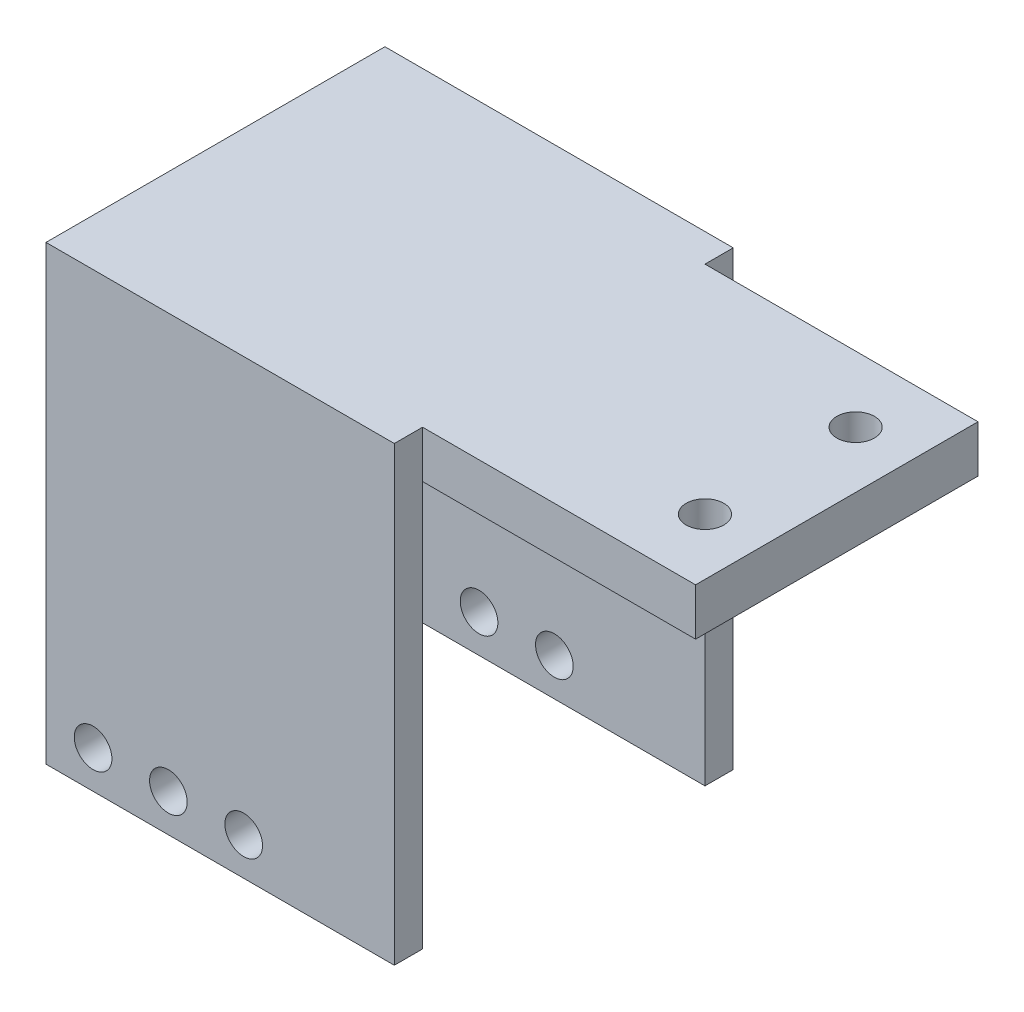
ISO-10303-21;
HEADER;
FILE_DESCRIPTION(('STEP AP214'),'2;1');
FILE_NAME('part.step','',(''),(''),'','','');
FILE_SCHEMA(('AUTOMOTIVE_DESIGN { 1 0 10303 214 1 1 1 1 }'));
ENDSEC;
DATA;
#1=APPLICATION_CONTEXT('core data for automotive mechanical design processes');
#2=APPLICATION_PROTOCOL_DEFINITION('international standard','automotive_design',2000,#1);
#3=PRODUCT_CONTEXT('',#1,'mechanical');
#4=PRODUCT('Part','Part','',(#3));
#5=PRODUCT_RELATED_PRODUCT_CATEGORY('part','',(#4));
#6=PRODUCT_DEFINITION_FORMATION('','',#4);
#7=PRODUCT_DEFINITION_CONTEXT('part definition',#1,'design');
#8=PRODUCT_DEFINITION('design','',#6,#7);
#9=PRODUCT_DEFINITION_SHAPE('','',#8);
#10=(LENGTH_UNIT() NAMED_UNIT(*) SI_UNIT(.MILLI.,.METRE.));
#11=(NAMED_UNIT(*) PLANE_ANGLE_UNIT() SI_UNIT($,.RADIAN.));
#12=(NAMED_UNIT(*) SI_UNIT($,.STERADIAN.) SOLID_ANGLE_UNIT());
#13=UNCERTAINTY_MEASURE_WITH_UNIT(LENGTH_MEASURE(1.E-05),#10,'distance_accuracy_value','');
#14=(GEOMETRIC_REPRESENTATION_CONTEXT(3) GLOBAL_UNCERTAINTY_ASSIGNED_CONTEXT((#13)) GLOBAL_UNIT_ASSIGNED_CONTEXT((#10,
#11,#12)) REPRESENTATION_CONTEXT('',''));
#15=CARTESIAN_POINT('',(0.,0.,0.));
#16=DIRECTION('',(0.,0.,1.));
#17=DIRECTION('',(1.,0.,0.));
#18=AXIS2_PLACEMENT_3D('',#15,#16,#17);
#19=CARTESIAN_POINT('',(0.,5.,0.));
#20=DIRECTION('',(0.,0.,-1.));
#21=DIRECTION('',(-1.,0.,0.));
#22=AXIS2_PLACEMENT_3D('',#19,#20,#21);
#23=PLANE('',#22);
#24=DIRECTION('',(0.,1.,0.));
#25=VECTOR('',#24,1.);
#26=CARTESIAN_POINT('',(37.,-43.,0.));
#27=LINE('',#26,#25);
#28=CARTESIAN_POINT('',(37.,0.,0.));
#29=VERTEX_POINT('',#28);
#30=CARTESIAN_POINT('',(37.,5.,0.));
#31=VERTEX_POINT('',#30);
#32=EDGE_CURVE('E12',#29,#31,#27,.T.);
#33=ORIENTED_EDGE('',*,*,#32,.F.);
#34=DIRECTION('',(1.,0.,0.));
#35=VECTOR('',#34,1.);
#36=CARTESIAN_POINT('',(0.,0.,0.));
#37=LINE('',#36,#35);
#38=CARTESIAN_POINT('',(66.,0.,0.));
#39=VERTEX_POINT('',#38);
#40=EDGE_CURVE('E209',#29,#39,#37,.T.);
#41=ORIENTED_EDGE('',*,*,#40,.T.);
#42=DIRECTION('',(0.,-1.,0.));
#43=VECTOR('',#42,1.);
#44=CARTESIAN_POINT('',(66.,5.,0.));
#45=LINE('',#44,#43);
#46=CARTESIAN_POINT('',(66.,5.,0.));
#47=VERTEX_POINT('',#46);
#48=EDGE_CURVE('E38',#47,#39,#45,.T.);
#49=ORIENTED_EDGE('',*,*,#48,.F.);
#50=DIRECTION('',(1.,0.,0.));
#51=VECTOR('',#50,1.);
#52=CARTESIAN_POINT('',(0.,5.,0.));
#53=LINE('',#52,#51);
#54=EDGE_CURVE('E199',#31,#47,#53,.T.);
#55=ORIENTED_EDGE('',*,*,#54,.F.);
#56=EDGE_LOOP('',(#33,#41,#49,#55));
#57=FACE_BOUND('',#56,.T.);
#58=ADVANCED_FACE('F34',(#57),#23,.F.);
#59=CARTESIAN_POINT('',(0.,5.,0.));
#60=DIRECTION('',(0.,-1.,0.));
#61=DIRECTION('',(0.,0.,-1.));
#62=AXIS2_PLACEMENT_3D('',#59,#60,#61);
#63=PLANE('',#62);
#64=DIRECTION('',(0.,0.,1.));
#65=VECTOR('',#64,1.);
#66=CARTESIAN_POINT('',(0.,5.,0.));
#67=LINE('',#66,#65);
#68=CARTESIAN_POINT('',(0.,5.,-33.));
#69=VERTEX_POINT('',#68);
#70=CARTESIAN_POINT('',(0.,5.,3.));
#71=VERTEX_POINT('',#70);
#72=EDGE_CURVE('E197',#69,#71,#67,.T.);
#73=ORIENTED_EDGE('',*,*,#72,.T.);
#74=DIRECTION('',(1.,0.,0.));
#75=VECTOR('',#74,1.);
#76=CARTESIAN_POINT('',(0.,5.,3.));
#77=LINE('',#76,#75);
#78=CARTESIAN_POINT('',(37.,5.,3.));
#79=VERTEX_POINT('',#78);
#80=EDGE_CURVE('E124',#71,#79,#77,.T.);
#81=ORIENTED_EDGE('',*,*,#80,.T.);
#82=DIRECTION('',(0.,0.,-1.));
#83=VECTOR('',#82,1.);
#84=CARTESIAN_POINT('',(37.,5.,0.));
#85=LINE('',#84,#83);
#86=EDGE_CURVE('E143',#79,#31,#85,.T.);
#87=ORIENTED_EDGE('',*,*,#86,.T.);
#88=ORIENTED_EDGE('',*,*,#54,.T.);
#89=DIRECTION('',(0.,0.,-1.));
#90=VECTOR('',#89,1.);
#91=CARTESIAN_POINT('',(66.,5.,0.));
#92=LINE('',#91,#90);
#93=CARTESIAN_POINT('',(66.,5.,-30.));
#94=VERTEX_POINT('',#93);
#95=EDGE_CURVE('E202',#47,#94,#92,.T.);
#96=ORIENTED_EDGE('',*,*,#95,.T.);
#97=DIRECTION('',(-1.,0.,0.));
#98=VECTOR('',#97,1.);
#99=CARTESIAN_POINT('',(0.,5.,-30.));
#100=LINE('',#99,#98);
#101=CARTESIAN_POINT('',(37.,5.,-30.));
#102=VERTEX_POINT('',#101);
#103=EDGE_CURVE('E204',#94,#102,#100,.T.);
#104=ORIENTED_EDGE('',*,*,#103,.T.);
#105=DIRECTION('',(0.,0.,-1.));
#106=VECTOR('',#105,1.);
#107=CARTESIAN_POINT('',(37.,5.,-30.));
#108=LINE('',#107,#106);
#109=CARTESIAN_POINT('',(37.,5.,-33.));
#110=VERTEX_POINT('',#109);
#111=EDGE_CURVE('E58',#102,#110,#108,.T.);
#112=ORIENTED_EDGE('',*,*,#111,.T.);
#113=DIRECTION('',(-1.,0.,0.));
#114=VECTOR('',#113,1.);
#115=CARTESIAN_POINT('',(0.,5.,-33.));
#116=LINE('',#115,#114);
#117=EDGE_CURVE('E161',#110,#69,#116,.T.);
#118=ORIENTED_EDGE('',*,*,#117,.T.);
#119=EDGE_LOOP('',(#73,#81,#87,#88,#96,#104,#112,#118));
#120=FACE_BOUND('',#119,.T.);
#121=CARTESIAN_POINT('',(60.,5.,-23.));
#122=DIRECTION('',(0.,1.,0.));
#123=DIRECTION('',(0.,0.,1.));
#124=AXIS2_PLACEMENT_3D('',#121,#122,#123);
#125=CIRCLE('',#124,2.);
#126=CARTESIAN_POINT('',(60.,5.,-21.));
#127=VERTEX_POINT('',#126);
#128=EDGE_CURVE('E191',#127,#127,#125,.T.);
#129=ORIENTED_EDGE('',*,*,#128,.F.);
#130=EDGE_LOOP('',(#129));
#131=FACE_BOUND('',#130,.T.);
#132=CARTESIAN_POINT('',(60.,5.,-7.));
#133=DIRECTION('',(0.,1.,0.));
#134=DIRECTION('',(0.,0.,1.));
#135=AXIS2_PLACEMENT_3D('',#132,#133,#134);
#136=CIRCLE('',#135,2.);
#137=CARTESIAN_POINT('',(60.,5.,-5.));
#138=VERTEX_POINT('',#137);
#139=EDGE_CURVE('E185',#138,#138,#136,.T.);
#140=ORIENTED_EDGE('',*,*,#139,.F.);
#141=EDGE_LOOP('',(#140));
#142=FACE_BOUND('',#141,.T.);
#143=ADVANCED_FACE('F229',(#120,#131,#142),#63,.F.);
#144=CARTESIAN_POINT('',(0.,0.,0.));
#145=DIRECTION('',(0.,-1.,0.));
#146=DIRECTION('',(0.,0.,-1.));
#147=AXIS2_PLACEMENT_3D('',#144,#145,#146);
#148=PLANE('',#147);
#149=CARTESIAN_POINT('',(60.,0.,-23.));
#150=DIRECTION('',(0.,1.,0.));
#151=DIRECTION('',(0.,0.,1.));
#152=AXIS2_PLACEMENT_3D('',#149,#150,#151);
#153=CIRCLE('',#152,2.);
#154=CARTESIAN_POINT('',(60.,0.,-21.));
#155=VERTEX_POINT('',#154);
#156=EDGE_CURVE('E188',#155,#155,#153,.T.);
#157=ORIENTED_EDGE('',*,*,#156,.T.);
#158=EDGE_LOOP('',(#157));
#159=FACE_BOUND('',#158,.T.);
#160=DIRECTION('',(0.,0.,1.));
#161=VECTOR('',#160,1.);
#162=CARTESIAN_POINT('',(0.,0.,0.));
#163=LINE('',#162,#161);
#164=CARTESIAN_POINT('',(0.,0.,-30.));
#165=VERTEX_POINT('',#164);
#166=CARTESIAN_POINT('',(0.,0.,0.));
#167=VERTEX_POINT('',#166);
#168=EDGE_CURVE('E194',#165,#167,#163,.T.);
#169=ORIENTED_EDGE('',*,*,#168,.F.);
#170=DIRECTION('',(-1.,0.,0.));
#171=VECTOR('',#170,1.);
#172=CARTESIAN_POINT('',(0.,0.,-30.));
#173=LINE('',#172,#171);
#174=CARTESIAN_POINT('',(37.,0.,-30.));
#175=VERTEX_POINT('',#174);
#176=EDGE_CURVE('E215',#175,#165,#173,.T.);
#177=ORIENTED_EDGE('',*,*,#176,.F.);
#178=CARTESIAN_POINT('',(66.,0.,-30.));
#179=VERTEX_POINT('',#178);
#180=EDGE_CURVE('E200',#179,#175,#173,.T.);
#181=ORIENTED_EDGE('',*,*,#180,.F.);
#182=DIRECTION('',(0.,0.,-1.));
#183=VECTOR('',#182,1.);
#184=CARTESIAN_POINT('',(66.,0.,0.));
#185=LINE('',#184,#183);
#186=EDGE_CURVE('E213',#39,#179,#185,.T.);
#187=ORIENTED_EDGE('',*,*,#186,.F.);
#188=ORIENTED_EDGE('',*,*,#40,.F.);
#189=EDGE_CURVE('E210',#167,#29,#37,.T.);
#190=ORIENTED_EDGE('',*,*,#189,.F.);
#191=EDGE_LOOP('',(#169,#177,#181,#187,#188,#190));
#192=FACE_BOUND('',#191,.T.);
#193=CARTESIAN_POINT('',(60.,0.,-7.));
#194=DIRECTION('',(0.,1.,0.));
#195=DIRECTION('',(0.,0.,1.));
#196=AXIS2_PLACEMENT_3D('',#193,#194,#195);
#197=CIRCLE('',#196,2.);
#198=CARTESIAN_POINT('',(60.,0.,-5.));
#199=VERTEX_POINT('',#198);
#200=EDGE_CURVE('E177',#199,#199,#197,.T.);
#201=ORIENTED_EDGE('',*,*,#200,.T.);
#202=EDGE_LOOP('',(#201));
#203=FACE_BOUND('',#202,.T.);
#204=ADVANCED_FACE('F235',(#159,#192,#203),#148,.T.);
#205=CARTESIAN_POINT('',(0.,5.,0.));
#206=DIRECTION('',(1.,0.,0.));
#207=DIRECTION('',(0.,0.,-1.));
#208=AXIS2_PLACEMENT_3D('',#205,#206,#207);
#209=PLANE('',#208);
#210=ORIENTED_EDGE('',*,*,#168,.T.);
#211=DIRECTION('',(0.,1.,0.));
#212=VECTOR('',#211,1.);
#213=CARTESIAN_POINT('',(0.,-43.,0.));
#214=LINE('',#213,#212);
#215=CARTESIAN_POINT('',(0.,-43.,0.));
#216=VERTEX_POINT('',#215);
#217=EDGE_CURVE('E142',#216,#167,#214,.T.);
#218=ORIENTED_EDGE('',*,*,#217,.F.);
#219=DIRECTION('',(0.,0.,1.));
#220=VECTOR('',#219,1.);
#221=CARTESIAN_POINT('',(0.,-43.,0.));
#222=LINE('',#221,#220);
#223=CARTESIAN_POINT('',(0.,-43.,3.));
#224=VERTEX_POINT('',#223);
#225=EDGE_CURVE('E135',#216,#224,#222,.T.);
#226=ORIENTED_EDGE('',*,*,#225,.T.);
#227=DIRECTION('',(0.,1.,0.));
#228=VECTOR('',#227,1.);
#229=CARTESIAN_POINT('',(0.,-43.,3.));
#230=LINE('',#229,#228);
#231=EDGE_CURVE('E119',#224,#71,#230,.T.);
#232=ORIENTED_EDGE('',*,*,#231,.T.);
#233=ORIENTED_EDGE('',*,*,#72,.F.);
#234=DIRECTION('',(0.,1.,0.));
#235=VECTOR('',#234,1.);
#236=CARTESIAN_POINT('',(0.,-43.,-33.));
#237=LINE('',#236,#235);
#238=CARTESIAN_POINT('',(0.,-43.,-33.));
#239=VERTEX_POINT('',#238);
#240=EDGE_CURVE('E174',#239,#69,#237,.T.);
#241=ORIENTED_EDGE('',*,*,#240,.F.);
#242=DIRECTION('',(0.,0.,1.));
#243=VECTOR('',#242,1.);
#244=CARTESIAN_POINT('',(0.,-43.,-30.));
#245=LINE('',#244,#243);
#246=CARTESIAN_POINT('',(0.,-43.,-30.));
#247=VERTEX_POINT('',#246);
#248=EDGE_CURVE('E157',#239,#247,#245,.T.);
#249=ORIENTED_EDGE('',*,*,#248,.T.);
#250=DIRECTION('',(0.,1.,0.));
#251=VECTOR('',#250,1.);
#252=CARTESIAN_POINT('',(0.,-43.,-30.));
#253=LINE('',#252,#251);
#254=EDGE_CURVE('E170',#247,#165,#253,.T.);
#255=ORIENTED_EDGE('',*,*,#254,.T.);
#256=EDGE_LOOP('',(#210,#218,#226,#232,#233,#241,#249,#255));
#257=FACE_BOUND('',#256,.T.);
#258=ADVANCED_FACE('F36',(#257),#209,.F.);
#259=CARTESIAN_POINT('',(66.,5.,0.));
#260=DIRECTION('',(-1.,0.,0.));
#261=DIRECTION('',(0.,0.,1.));
#262=AXIS2_PLACEMENT_3D('',#259,#260,#261);
#263=PLANE('',#262);
#264=ORIENTED_EDGE('',*,*,#186,.T.);
#265=DIRECTION('',(0.,-1.,0.));
#266=VECTOR('',#265,1.);
#267=CARTESIAN_POINT('',(66.,5.,-30.));
#268=LINE('',#267,#266);
#269=EDGE_CURVE('E207',#94,#179,#268,.T.);
#270=ORIENTED_EDGE('',*,*,#269,.F.);
#271=ORIENTED_EDGE('',*,*,#95,.F.);
#272=ORIENTED_EDGE('',*,*,#48,.T.);
#273=EDGE_LOOP('',(#264,#270,#271,#272));
#274=FACE_BOUND('',#273,.T.);
#275=ADVANCED_FACE('F232',(#274),#263,.F.);
#276=CARTESIAN_POINT('',(0.,5.,-30.));
#277=DIRECTION('',(0.,0.,1.));
#278=DIRECTION('',(1.,0.,0.));
#279=AXIS2_PLACEMENT_3D('',#276,#277,#278);
#280=PLANE('',#279);
#281=ORIENTED_EDGE('',*,*,#180,.T.);
#282=DIRECTION('',(0.,1.,0.));
#283=VECTOR('',#282,1.);
#284=CARTESIAN_POINT('',(37.,-43.,-30.));
#285=LINE('',#284,#283);
#286=EDGE_CURVE('E43',#175,#102,#285,.T.);
#287=ORIENTED_EDGE('',*,*,#286,.T.);
#288=ORIENTED_EDGE('',*,*,#103,.F.);
#289=ORIENTED_EDGE('',*,*,#269,.T.);
#290=EDGE_LOOP('',(#281,#287,#288,#289));
#291=FACE_BOUND('',#290,.T.);
#292=ADVANCED_FACE('F227',(#291),#280,.F.);
#293=CARTESIAN_POINT('',(60.,5.,-23.));
#294=DIRECTION('',(0.,-1.,0.));
#295=DIRECTION('',(0.,0.,-1.));
#296=AXIS2_PLACEMENT_3D('',#293,#294,#295);
#297=CYLINDRICAL_SURFACE('',#296,2.);
#298=ORIENTED_EDGE('',*,*,#128,.T.);
#299=EDGE_LOOP('',(#298));
#300=FACE_BOUND('',#299,.T.);
#301=ORIENTED_EDGE('',*,*,#156,.F.);
#302=EDGE_LOOP('',(#301));
#303=FACE_BOUND('',#302,.T.);
#304=ADVANCED_FACE('F270',(#300,#303),#297,.F.);
#305=CARTESIAN_POINT('',(60.,5.,-7.));
#306=DIRECTION('',(0.,-1.,0.));
#307=DIRECTION('',(0.,0.,-1.));
#308=AXIS2_PLACEMENT_3D('',#305,#306,#307);
#309=CYLINDRICAL_SURFACE('',#308,2.);
#310=ORIENTED_EDGE('',*,*,#139,.T.);
#311=EDGE_LOOP('',(#310));
#312=FACE_BOUND('',#311,.T.);
#313=ORIENTED_EDGE('',*,*,#200,.F.);
#314=EDGE_LOOP('',(#313));
#315=FACE_BOUND('',#314,.T.);
#316=ADVANCED_FACE('F257',(#312,#315),#309,.F.);
#317=CARTESIAN_POINT('',(0.,-43.,-33.));
#318=DIRECTION('',(0.,0.,-1.));
#319=DIRECTION('',(-1.,0.,0.));
#320=AXIS2_PLACEMENT_3D('',#317,#318,#319);
#321=PLANE('',#320);
#322=CARTESIAN_POINT('',(21.,-39.,-33.));
#323=DIRECTION('',(0.,0.,-1.));
#324=DIRECTION('',(-1.,0.,0.));
#325=AXIS2_PLACEMENT_3D('',#322,#323,#324);
#326=CIRCLE('',#325,2.);
#327=CARTESIAN_POINT('',(19.,-39.,-33.));
#328=VERTEX_POINT('',#327);
#329=EDGE_CURVE('E148',#328,#328,#326,.T.);
#330=ORIENTED_EDGE('',*,*,#329,.F.);
#331=EDGE_LOOP('',(#330));
#332=FACE_BOUND('',#331,.T.);
#333=CARTESIAN_POINT('',(13.,-39.,-33.));
#334=DIRECTION('',(0.,0.,-1.));
#335=DIRECTION('',(-1.,0.,0.));
#336=AXIS2_PLACEMENT_3D('',#333,#334,#335);
#337=CIRCLE('',#336,2.);
#338=CARTESIAN_POINT('',(11.,-39.,-33.));
#339=VERTEX_POINT('',#338);
#340=EDGE_CURVE('E468',#339,#339,#337,.T.);
#341=ORIENTED_EDGE('',*,*,#340,.F.);
#342=EDGE_LOOP('',(#341));
#343=FACE_BOUND('',#342,.T.);
#344=CARTESIAN_POINT('',(5.,-39.,-33.));
#345=DIRECTION('',(0.,0.,-1.));
#346=DIRECTION('',(-1.,0.,0.));
#347=AXIS2_PLACEMENT_3D('',#344,#345,#346);
#348=CIRCLE('',#347,2.);
#349=CARTESIAN_POINT('',(3.,-39.,-33.));
#350=VERTEX_POINT('',#349);
#351=EDGE_CURVE('E479',#350,#350,#348,.T.);
#352=ORIENTED_EDGE('',*,*,#351,.F.);
#353=EDGE_LOOP('',(#352));
#354=FACE_BOUND('',#353,.T.);
#355=ORIENTED_EDGE('',*,*,#117,.F.);
#356=DIRECTION('',(0.,1.,0.));
#357=VECTOR('',#356,1.);
#358=CARTESIAN_POINT('',(37.,-43.,-33.));
#359=LINE('',#358,#357);
#360=CARTESIAN_POINT('',(37.,-43.,-33.));
#361=VERTEX_POINT('',#360);
#362=EDGE_CURVE('E178',#361,#110,#359,.T.);
#363=ORIENTED_EDGE('',*,*,#362,.F.);
#364=DIRECTION('',(-1.,0.,0.));
#365=VECTOR('',#364,1.);
#366=CARTESIAN_POINT('',(0.,-43.,-33.));
#367=LINE('',#366,#365);
#368=EDGE_CURVE('E167',#361,#239,#367,.T.);
#369=ORIENTED_EDGE('',*,*,#368,.T.);
#370=ORIENTED_EDGE('',*,*,#240,.T.);
#371=EDGE_LOOP('',(#355,#363,#369,#370));
#372=FACE_BOUND('',#371,.T.);
#373=ADVANCED_FACE('F247',(#332,#343,#354,#372),#321,.T.);
#374=CARTESIAN_POINT('',(37.,-43.,-30.));
#375=DIRECTION('',(1.,0.,0.));
#376=DIRECTION('',(0.,0.,-1.));
#377=AXIS2_PLACEMENT_3D('',#374,#375,#376);
#378=PLANE('',#377);
#379=ORIENTED_EDGE('',*,*,#111,.F.);
#380=ORIENTED_EDGE('',*,*,#286,.F.);
#381=CARTESIAN_POINT('',(37.,-43.,-30.));
#382=VERTEX_POINT('',#381);
#383=EDGE_CURVE('E180',#382,#175,#285,.T.);
#384=ORIENTED_EDGE('',*,*,#383,.F.);
#385=DIRECTION('',(0.,0.,-1.));
#386=VECTOR('',#385,1.);
#387=CARTESIAN_POINT('',(37.,-43.,-30.));
#388=LINE('',#387,#386);
#389=EDGE_CURVE('E164',#382,#361,#388,.T.);
#390=ORIENTED_EDGE('',*,*,#389,.T.);
#391=ORIENTED_EDGE('',*,*,#362,.T.);
#392=EDGE_LOOP('',(#379,#380,#384,#390,#391));
#393=FACE_BOUND('',#392,.T.);
#394=ADVANCED_FACE('F248',(#393),#378,.T.);
#395=CARTESIAN_POINT('',(0.,-43.,-30.));
#396=DIRECTION('',(0.,0.,1.));
#397=DIRECTION('',(1.,0.,0.));
#398=AXIS2_PLACEMENT_3D('',#395,#396,#397);
#399=PLANE('',#398);
#400=CARTESIAN_POINT('',(21.,-39.,-30.));
#401=DIRECTION('',(0.,0.,1.));
#402=DIRECTION('',(1.,0.,0.));
#403=AXIS2_PLACEMENT_3D('',#400,#401,#402);
#404=CIRCLE('',#403,2.);
#405=CARTESIAN_POINT('',(23.,-39.,-30.));
#406=VERTEX_POINT('',#405);
#407=EDGE_CURVE('E465',#406,#406,#404,.T.);
#408=ORIENTED_EDGE('',*,*,#407,.F.);
#409=EDGE_LOOP('',(#408));
#410=FACE_BOUND('',#409,.T.);
#411=CARTESIAN_POINT('',(13.,-39.,-30.));
#412=DIRECTION('',(0.,0.,1.));
#413=DIRECTION('',(1.,0.,0.));
#414=AXIS2_PLACEMENT_3D('',#411,#412,#413);
#415=CIRCLE('',#414,2.);
#416=CARTESIAN_POINT('',(15.,-39.,-30.));
#417=VERTEX_POINT('',#416);
#418=EDGE_CURVE('E473',#417,#417,#415,.T.);
#419=ORIENTED_EDGE('',*,*,#418,.F.);
#420=EDGE_LOOP('',(#419));
#421=FACE_BOUND('',#420,.T.);
#422=CARTESIAN_POINT('',(5.,-39.,-30.));
#423=DIRECTION('',(0.,0.,1.));
#424=DIRECTION('',(1.,0.,0.));
#425=AXIS2_PLACEMENT_3D('',#422,#423,#424);
#426=CIRCLE('',#425,2.);
#427=CARTESIAN_POINT('',(7.,-39.,-30.));
#428=VERTEX_POINT('',#427);
#429=EDGE_CURVE('E482',#428,#428,#426,.T.);
#430=ORIENTED_EDGE('',*,*,#429,.F.);
#431=EDGE_LOOP('',(#430));
#432=FACE_BOUND('',#431,.T.);
#433=ORIENTED_EDGE('',*,*,#383,.T.);
#434=ORIENTED_EDGE('',*,*,#176,.T.);
#435=ORIENTED_EDGE('',*,*,#254,.F.);
#436=DIRECTION('',(1.,0.,0.));
#437=VECTOR('',#436,1.);
#438=CARTESIAN_POINT('',(0.,-43.,-30.));
#439=LINE('',#438,#437);
#440=EDGE_CURVE('E160',#247,#382,#439,.T.);
#441=ORIENTED_EDGE('',*,*,#440,.T.);
#442=EDGE_LOOP('',(#433,#434,#435,#441));
#443=FACE_BOUND('',#442,.T.);
#444=ADVANCED_FACE('F239',(#410,#421,#432,#443),#399,.T.);
#445=CARTESIAN_POINT('',(0.,-43.,0.));
#446=DIRECTION('',(0.,-1.,0.));
#447=DIRECTION('',(0.,0.,-1.));
#448=AXIS2_PLACEMENT_3D('',#445,#446,#447);
#449=PLANE('',#448);
#450=ORIENTED_EDGE('',*,*,#248,.F.);
#451=ORIENTED_EDGE('',*,*,#368,.F.);
#452=ORIENTED_EDGE('',*,*,#389,.F.);
#453=ORIENTED_EDGE('',*,*,#440,.F.);
#454=EDGE_LOOP('',(#450,#451,#452,#453));
#455=FACE_BOUND('',#454,.T.);
#456=ADVANCED_FACE('F244',(#455),#449,.T.);
#457=CARTESIAN_POINT('',(0.,-43.,0.));
#458=DIRECTION('',(0.,0.,-1.));
#459=DIRECTION('',(-1.,0.,0.));
#460=AXIS2_PLACEMENT_3D('',#457,#458,#459);
#461=PLANE('',#460);
#462=CARTESIAN_POINT('',(21.,-39.,0.));
#463=DIRECTION('',(0.,0.,-1.));
#464=DIRECTION('',(-1.,0.,0.));
#465=AXIS2_PLACEMENT_3D('',#462,#463,#464);
#466=CIRCLE('',#465,2.);
#467=CARTESIAN_POINT('',(19.,-39.,0.));
#468=VERTEX_POINT('',#467);
#469=EDGE_CURVE('E466',#468,#468,#466,.T.);
#470=ORIENTED_EDGE('',*,*,#469,.F.);
#471=EDGE_LOOP('',(#470));
#472=FACE_BOUND('',#471,.T.);
#473=CARTESIAN_POINT('',(13.,-39.,0.));
#474=DIRECTION('',(0.,0.,-1.));
#475=DIRECTION('',(-1.,0.,0.));
#476=AXIS2_PLACEMENT_3D('',#473,#474,#475);
#477=CIRCLE('',#476,2.);
#478=CARTESIAN_POINT('',(11.,-39.,0.));
#479=VERTEX_POINT('',#478);
#480=EDGE_CURVE('E476',#479,#479,#477,.T.);
#481=ORIENTED_EDGE('',*,*,#480,.F.);
#482=EDGE_LOOP('',(#481));
#483=FACE_BOUND('',#482,.T.);
#484=CARTESIAN_POINT('',(5.,-39.,0.));
#485=DIRECTION('',(0.,0.,-1.));
#486=DIRECTION('',(-1.,0.,0.));
#487=AXIS2_PLACEMENT_3D('',#484,#485,#486);
#488=CIRCLE('',#487,2.);
#489=CARTESIAN_POINT('',(3.,-39.,0.));
#490=VERTEX_POINT('',#489);
#491=EDGE_CURVE('E485',#490,#490,#488,.T.);
#492=ORIENTED_EDGE('',*,*,#491,.F.);
#493=EDGE_LOOP('',(#492));
#494=FACE_BOUND('',#493,.T.);
#495=ORIENTED_EDGE('',*,*,#217,.T.);
#496=ORIENTED_EDGE('',*,*,#189,.T.);
#497=CARTESIAN_POINT('',(37.,-43.,0.));
#498=VERTEX_POINT('',#497);
#499=EDGE_CURVE('E45',#498,#29,#27,.T.);
#500=ORIENTED_EDGE('',*,*,#499,.F.);
#501=DIRECTION('',(-1.,0.,0.));
#502=VECTOR('',#501,1.);
#503=CARTESIAN_POINT('',(0.,-43.,0.));
#504=LINE('',#503,#502);
#505=EDGE_CURVE('E128',#498,#216,#504,.T.);
#506=ORIENTED_EDGE('',*,*,#505,.T.);
#507=EDGE_LOOP('',(#495,#496,#500,#506));
#508=FACE_BOUND('',#507,.T.);
#509=ADVANCED_FACE('F311',(#472,#483,#494,#508),#461,.T.);
#510=CARTESIAN_POINT('',(37.,-43.,0.));
#511=DIRECTION('',(1.,0.,0.));
#512=DIRECTION('',(0.,0.,-1.));
#513=AXIS2_PLACEMENT_3D('',#510,#511,#512);
#514=PLANE('',#513);
#515=ORIENTED_EDGE('',*,*,#86,.F.);
#516=DIRECTION('',(0.,1.,0.));
#517=VECTOR('',#516,1.);
#518=CARTESIAN_POINT('',(37.,-43.,3.));
#519=LINE('',#518,#517);
#520=CARTESIAN_POINT('',(37.,-43.,3.));
#521=VERTEX_POINT('',#520);
#522=EDGE_CURVE('E127',#521,#79,#519,.T.);
#523=ORIENTED_EDGE('',*,*,#522,.F.);
#524=DIRECTION('',(0.,0.,-1.));
#525=VECTOR('',#524,1.);
#526=CARTESIAN_POINT('',(37.,-43.,0.));
#527=LINE('',#526,#525);
#528=EDGE_CURVE('E138',#521,#498,#527,.T.);
#529=ORIENTED_EDGE('',*,*,#528,.T.);
#530=ORIENTED_EDGE('',*,*,#499,.T.);
#531=ORIENTED_EDGE('',*,*,#32,.T.);
#532=EDGE_LOOP('',(#515,#523,#529,#530,#531));
#533=FACE_BOUND('',#532,.T.);
#534=ADVANCED_FACE('F316',(#533),#514,.T.);
#535=CARTESIAN_POINT('',(0.,-43.,3.));
#536=DIRECTION('',(0.,0.,1.));
#537=DIRECTION('',(1.,0.,0.));
#538=AXIS2_PLACEMENT_3D('',#535,#536,#537);
#539=PLANE('',#538);
#540=CARTESIAN_POINT('',(21.,-39.,3.));
#541=DIRECTION('',(0.,0.,1.));
#542=DIRECTION('',(1.,0.,0.));
#543=AXIS2_PLACEMENT_3D('',#540,#541,#542);
#544=CIRCLE('',#543,2.);
#545=CARTESIAN_POINT('',(23.,-39.,3.));
#546=VERTEX_POINT('',#545);
#547=EDGE_CURVE('E488',#546,#546,#544,.T.);
#548=ORIENTED_EDGE('',*,*,#547,.F.);
#549=EDGE_LOOP('',(#548));
#550=FACE_BOUND('',#549,.T.);
#551=CARTESIAN_POINT('',(13.,-39.,3.));
#552=DIRECTION('',(0.,0.,1.));
#553=DIRECTION('',(1.,0.,0.));
#554=AXIS2_PLACEMENT_3D('',#551,#552,#553);
#555=CIRCLE('',#554,2.);
#556=CARTESIAN_POINT('',(15.,-39.,3.));
#557=VERTEX_POINT('',#556);
#558=EDGE_CURVE('E492',#557,#557,#555,.T.);
#559=ORIENTED_EDGE('',*,*,#558,.F.);
#560=EDGE_LOOP('',(#559));
#561=FACE_BOUND('',#560,.T.);
#562=CARTESIAN_POINT('',(5.,-39.,3.));
#563=DIRECTION('',(0.,0.,1.));
#564=DIRECTION('',(1.,0.,0.));
#565=AXIS2_PLACEMENT_3D('',#562,#563,#564);
#566=CIRCLE('',#565,2.);
#567=CARTESIAN_POINT('',(7.,-39.,3.));
#568=VERTEX_POINT('',#567);
#569=EDGE_CURVE('E489',#568,#568,#566,.T.);
#570=ORIENTED_EDGE('',*,*,#569,.F.);
#571=EDGE_LOOP('',(#570));
#572=FACE_BOUND('',#571,.T.);
#573=ORIENTED_EDGE('',*,*,#80,.F.);
#574=ORIENTED_EDGE('',*,*,#231,.F.);
#575=DIRECTION('',(1.,0.,0.));
#576=VECTOR('',#575,1.);
#577=CARTESIAN_POINT('',(0.,-43.,3.));
#578=LINE('',#577,#576);
#579=EDGE_CURVE('E122',#224,#521,#578,.T.);
#580=ORIENTED_EDGE('',*,*,#579,.T.);
#581=ORIENTED_EDGE('',*,*,#522,.T.);
#582=EDGE_LOOP('',(#573,#574,#580,#581));
#583=FACE_BOUND('',#582,.T.);
#584=ADVANCED_FACE('F121',(#550,#561,#572,#583),#539,.T.);
#585=CARTESIAN_POINT('',(0.,-43.,0.));
#586=DIRECTION('',(0.,1.,0.));
#587=DIRECTION('',(0.,0.,1.));
#588=AXIS2_PLACEMENT_3D('',#585,#586,#587);
#589=PLANE('',#588);
#590=ORIENTED_EDGE('',*,*,#225,.F.);
#591=ORIENTED_EDGE('',*,*,#505,.F.);
#592=ORIENTED_EDGE('',*,*,#528,.F.);
#593=ORIENTED_EDGE('',*,*,#579,.F.);
#594=EDGE_LOOP('',(#590,#591,#592,#593));
#595=FACE_BOUND('',#594,.T.);
#596=ADVANCED_FACE('F133',(#595),#589,.F.);
#597=CARTESIAN_POINT('',(5.,-39.,-41.));
#598=DIRECTION('',(0.,0.,1.));
#599=DIRECTION('',(1.,0.,0.));
#600=AXIS2_PLACEMENT_3D('',#597,#598,#599);
#601=CYLINDRICAL_SURFACE('',#600,2.);
#602=ORIENTED_EDGE('',*,*,#491,.T.);
#603=EDGE_LOOP('',(#602));
#604=FACE_BOUND('',#603,.T.);
#605=ORIENTED_EDGE('',*,*,#569,.T.);
#606=EDGE_LOOP('',(#605));
#607=FACE_BOUND('',#606,.T.);
#608=ADVANCED_FACE('F333',(#604,#607),#601,.F.);
#609=CARTESIAN_POINT('',(13.,-39.,-41.));
#610=DIRECTION('',(0.,0.,1.));
#611=DIRECTION('',(1.,0.,0.));
#612=AXIS2_PLACEMENT_3D('',#609,#610,#611);
#613=CYLINDRICAL_SURFACE('',#612,2.);
#614=ORIENTED_EDGE('',*,*,#480,.T.);
#615=EDGE_LOOP('',(#614));
#616=FACE_BOUND('',#615,.T.);
#617=ORIENTED_EDGE('',*,*,#558,.T.);
#618=EDGE_LOOP('',(#617));
#619=FACE_BOUND('',#618,.T.);
#620=ADVANCED_FACE('F338',(#616,#619),#613,.F.);
#621=CARTESIAN_POINT('',(21.,-39.,-41.));
#622=DIRECTION('',(0.,0.,1.));
#623=DIRECTION('',(1.,0.,0.));
#624=AXIS2_PLACEMENT_3D('',#621,#622,#623);
#625=CYLINDRICAL_SURFACE('',#624,2.);
#626=ORIENTED_EDGE('',*,*,#469,.T.);
#627=EDGE_LOOP('',(#626));
#628=FACE_BOUND('',#627,.T.);
#629=ORIENTED_EDGE('',*,*,#547,.T.);
#630=EDGE_LOOP('',(#629));
#631=FACE_BOUND('',#630,.T.);
#632=ADVANCED_FACE('F349',(#628,#631),#625,.F.);
#633=ORIENTED_EDGE('',*,*,#351,.T.);
#634=EDGE_LOOP('',(#633));
#635=FACE_BOUND('',#634,.T.);
#636=ORIENTED_EDGE('',*,*,#429,.T.);
#637=EDGE_LOOP('',(#636));
#638=FACE_BOUND('',#637,.T.);
#639=ADVANCED_FACE('F341',(#635,#638),#601,.F.);
#640=ORIENTED_EDGE('',*,*,#340,.T.);
#641=EDGE_LOOP('',(#640));
#642=FACE_BOUND('',#641,.T.);
#643=ORIENTED_EDGE('',*,*,#418,.T.);
#644=EDGE_LOOP('',(#643));
#645=FACE_BOUND('',#644,.T.);
#646=ADVANCED_FACE('F352',(#642,#645),#613,.F.);
#647=ORIENTED_EDGE('',*,*,#329,.T.);
#648=EDGE_LOOP('',(#647));
#649=FACE_BOUND('',#648,.T.);
#650=ORIENTED_EDGE('',*,*,#407,.T.);
#651=EDGE_LOOP('',(#650));
#652=FACE_BOUND('',#651,.T.);
#653=ADVANCED_FACE('F362',(#649,#652),#625,.F.);
#654=CLOSED_SHELL('',(#58,#143,#204,#258,#275,#292,#304,#316,#373,#394,#444,#456,#509,#534,#584,
#596,#608,#620,#632,#639,#646,#653));
#655=MANIFOLD_SOLID_BREP('B2',#654);
#656=ADVANCED_BREP_SHAPE_REPRESENTATION('',(#18,#655),#14);
#657=SHAPE_DEFINITION_REPRESENTATION(#9,#656);
ENDSEC;
END-ISO-10303-21;
